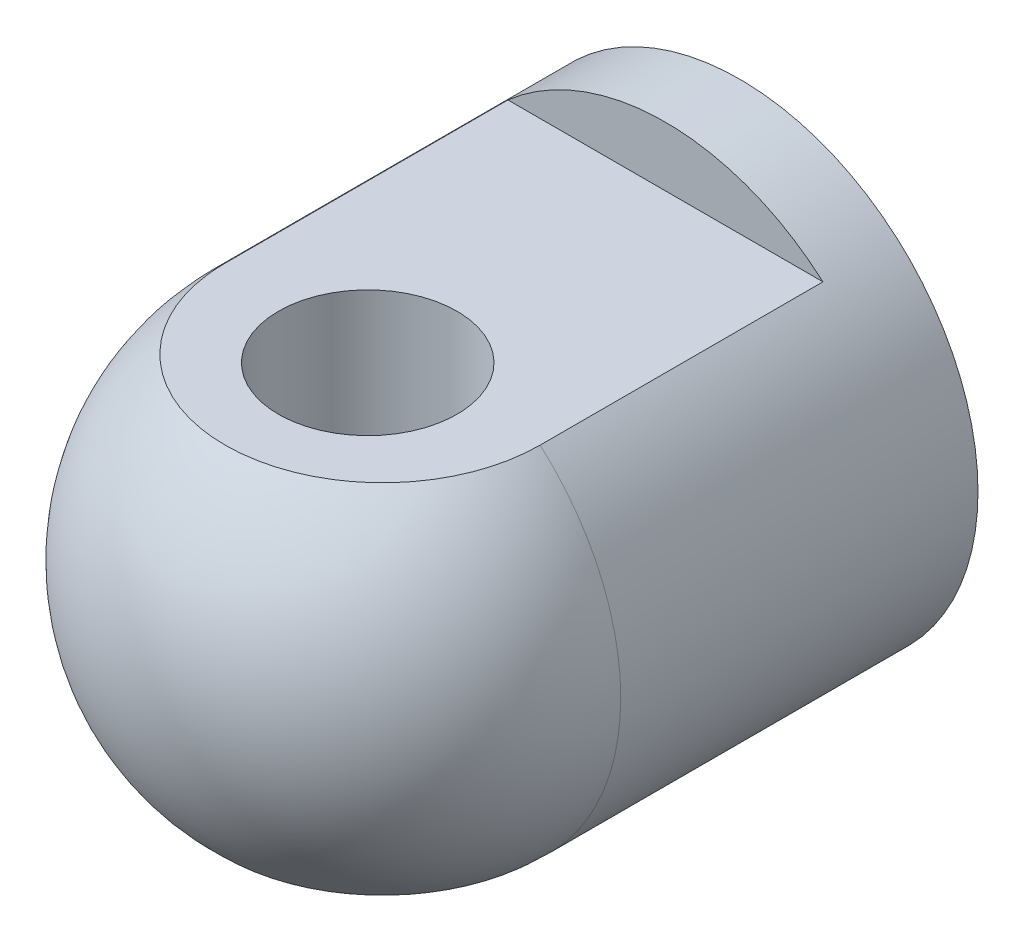
ISO-10303-21;
HEADER;
FILE_DESCRIPTION(('STEP AP214'),'2;1');
FILE_NAME('part.step','',(''),(''),'','','');
FILE_SCHEMA(('AUTOMOTIVE_DESIGN { 1 0 10303 214 1 1 1 1 }'));
ENDSEC;
DATA;
#1=APPLICATION_CONTEXT('core data for automotive mechanical design processes');
#2=APPLICATION_PROTOCOL_DEFINITION('international standard','automotive_design',2000,#1);
#3=PRODUCT_CONTEXT('',#1,'mechanical');
#4=PRODUCT('Part','Part','',(#3));
#5=PRODUCT_RELATED_PRODUCT_CATEGORY('part','',(#4));
#6=PRODUCT_DEFINITION_FORMATION('','',#4);
#7=PRODUCT_DEFINITION_CONTEXT('part definition',#1,'design');
#8=PRODUCT_DEFINITION('design','',#6,#7);
#9=PRODUCT_DEFINITION_SHAPE('','',#8);
#10=(LENGTH_UNIT() NAMED_UNIT(*) SI_UNIT(.MILLI.,.METRE.));
#11=(NAMED_UNIT(*) PLANE_ANGLE_UNIT() SI_UNIT($,.RADIAN.));
#12=(NAMED_UNIT(*) SI_UNIT($,.STERADIAN.) SOLID_ANGLE_UNIT());
#13=UNCERTAINTY_MEASURE_WITH_UNIT(LENGTH_MEASURE(1.E-05),#10,'distance_accuracy_value','');
#14=(GEOMETRIC_REPRESENTATION_CONTEXT(3) GLOBAL_UNCERTAINTY_ASSIGNED_CONTEXT((#13)) GLOBAL_UNIT_ASSIGNED_CONTEXT((#10,
#11,#12)) REPRESENTATION_CONTEXT('',''));
#15=CARTESIAN_POINT('',(0.,0.,0.));
#16=DIRECTION('',(0.,0.,1.));
#17=DIRECTION('',(1.,0.,0.));
#18=AXIS2_PLACEMENT_3D('',#15,#16,#17);
#19=CARTESIAN_POINT('',(0.,4.002,6.25));
#20=DIRECTION('',(0.,1.,0.));
#21=DIRECTION('',(-1.,0.,0.));
#22=AXIS2_PLACEMENT_3D('',#19,#20,#21);
#23=CYLINDRICAL_SURFACE('',#22,1.5);
#24=CARTESIAN_POINT('',(0.,-3.,6.25));
#25=DIRECTION('',(0.,1.,0.));
#26=DIRECTION('',(-1.,0.,0.));
#27=AXIS2_PLACEMENT_3D('',#24,#25,#26);
#28=CIRCLE('',#27,1.5);
#29=CARTESIAN_POINT('',(-1.5,-3.,6.25));
#30=VERTEX_POINT('',#29);
#31=EDGE_CURVE('E71',#30,#30,#28,.F.);
#32=ORIENTED_EDGE('',*,*,#31,.T.);
#33=EDGE_LOOP('',(#32));
#34=FACE_BOUND('',#33,.T.);
#35=CARTESIAN_POINT('',(0.,3.,6.25));
#36=DIRECTION('',(0.,1.,0.));
#37=DIRECTION('',(-1.,0.,0.));
#38=AXIS2_PLACEMENT_3D('',#35,#36,#37);
#39=CIRCLE('',#38,1.5);
#40=CARTESIAN_POINT('',(-1.5,3.,6.25));
#41=VERTEX_POINT('',#40);
#42=EDGE_CURVE('E120',#41,#41,#39,.T.);
#43=ORIENTED_EDGE('',*,*,#42,.T.);
#44=EDGE_LOOP('',(#43));
#45=FACE_BOUND('',#44,.T.);
#46=ADVANCED_FACE('F17',(#34,#45),#23,.F.);
#47=CARTESIAN_POINT('',(0.,0.,1.25));
#48=DIRECTION('',(0.,0.,1.));
#49=DIRECTION('',(1.,0.,0.));
#50=AXIS2_PLACEMENT_3D('',#47,#48,#49);
#51=PLANE('',#50);
#52=DIRECTION('',(-1.,0.,0.));
#53=VECTOR('',#52,1.);
#54=CARTESIAN_POINT('',(0.,-3.,1.25));
#55=LINE('',#54,#53);
#56=CARTESIAN_POINT('',(2.64575131106459,-3.,1.25));
#57=VERTEX_POINT('',#56);
#58=CARTESIAN_POINT('',(-2.64575131106459,-3.,1.25));
#59=VERTEX_POINT('',#58);
#60=EDGE_CURVE('E102',#57,#59,#55,.T.);
#61=ORIENTED_EDGE('',*,*,#60,.T.);
#62=CARTESIAN_POINT('',(0.,0.,1.25));
#63=DIRECTION('',(0.,0.,1.));
#64=DIRECTION('',(1.,0.,0.));
#65=AXIS2_PLACEMENT_3D('',#62,#63,#64);
#66=CIRCLE('',#65,4.);
#67=EDGE_CURVE('E91',#57,#59,#66,.F.);
#68=ORIENTED_EDGE('',*,*,#67,.F.);
#69=EDGE_LOOP('',(#61,#68));
#70=FACE_BOUND('',#69,.T.);
#71=ADVANCED_FACE('F129',(#70),#51,.T.);
#72=CARTESIAN_POINT('',(0.,0.,1.25));
#73=DIRECTION('',(0.,0.,1.));
#74=DIRECTION('',(1.,0.,0.));
#75=AXIS2_PLACEMENT_3D('',#72,#73,#74);
#76=PLANE('',#75);
#77=DIRECTION('',(1.,0.,0.));
#78=VECTOR('',#77,1.);
#79=CARTESIAN_POINT('',(0.,3.,1.25));
#80=LINE('',#79,#78);
#81=CARTESIAN_POINT('',(-2.64575131106459,3.,1.25));
#82=VERTEX_POINT('',#81);
#83=CARTESIAN_POINT('',(2.64575131106459,3.,1.25));
#84=VERTEX_POINT('',#83);
#85=EDGE_CURVE('E66',#82,#84,#80,.T.);
#86=ORIENTED_EDGE('',*,*,#85,.T.);
#87=CARTESIAN_POINT('',(0.,0.,1.25));
#88=DIRECTION('',(0.,0.,1.));
#89=DIRECTION('',(1.,0.,0.));
#90=AXIS2_PLACEMENT_3D('',#87,#88,#89);
#91=CIRCLE('',#90,4.);
#92=EDGE_CURVE('E79',#82,#84,#91,.F.);
#93=ORIENTED_EDGE('',*,*,#92,.F.);
#94=EDGE_LOOP('',(#86,#93));
#95=FACE_BOUND('',#94,.T.);
#96=ADVANCED_FACE('F127',(#95),#76,.T.);
#97=CARTESIAN_POINT('',(0.,3.,1.25));
#98=DIRECTION('',(0.,-1.,0.));
#99=DIRECTION('',(1.,0.,0.));
#100=AXIS2_PLACEMENT_3D('',#97,#98,#99);
#101=PLANE('',#100);
#102=DIRECTION('',(0.,0.,1.));
#103=VECTOR('',#102,1.);
#104=CARTESIAN_POINT('',(2.64575131106459,3.,10.));
#105=LINE('',#104,#103);
#106=CARTESIAN_POINT('',(2.64575131106459,3.,6.));
#107=VERTEX_POINT('',#106);
#108=EDGE_CURVE('E118',#84,#107,#105,.T.);
#109=ORIENTED_EDGE('',*,*,#108,.F.);
#110=ORIENTED_EDGE('',*,*,#85,.F.);
#111=DIRECTION('',(0.,0.,1.));
#112=VECTOR('',#111,1.);
#113=CARTESIAN_POINT('',(-2.6457513110646,3.,10.));
#114=LINE('',#113,#112);
#115=CARTESIAN_POINT('',(-2.64575131106459,3.,6.));
#116=VERTEX_POINT('',#115);
#117=EDGE_CURVE('E74',#116,#82,#114,.F.);
#118=ORIENTED_EDGE('',*,*,#117,.F.);
#119=CARTESIAN_POINT('',(2.64575131106459,3.,6.));
#120=CARTESIAN_POINT('',(2.64575843978466,3.,6.07441407751795));
#121=CARTESIAN_POINT('',(2.64261189448238,3.,6.14882477358548));
#122=CARTESIAN_POINT('',(2.63006662654231,3.,6.29711380384365));
#123=CARTESIAN_POINT('',(2.62066820326986,3.,6.37099216335352));
#124=CARTESIAN_POINT('',(2.59568312459834,3.,6.51764658621766));
#125=CARTESIAN_POINT('',(2.58010082367353,3.,6.59042338789464));
#126=CARTESIAN_POINT('',(2.54287440569758,3.,6.73438784358639));
#127=CARTESIAN_POINT('',(2.52123036230827,3.,6.80557551690078));
#128=CARTESIAN_POINT('',(2.44738123096619,3.,7.01606565706406));
#129=CARTESIAN_POINT('',(2.38624850541335,3.,7.15235734482172));
#130=CARTESIAN_POINT('',(2.24201134449796,3.,7.41263987733455));
#131=CARTESIAN_POINT('',(2.15891122566821,3.,7.53663313212285));
#132=CARTESIAN_POINT('',(1.97306553984951,3.,7.76893308391514));
#133=CARTESIAN_POINT('',(1.87031953976351,3.,7.87723943500596));
#134=CARTESIAN_POINT('',(1.64808904988257,3.,8.07507646815106));
#135=CARTESIAN_POINT('',(1.52860201334629,2.99999999999999,8.16460428832472));
#136=CARTESIAN_POINT('',(1.27629768528085,3.00000000000001,8.3223253613152));
#137=CARTESIAN_POINT('',(1.14348098244856,3.00000000000005,8.39051955577188));
#138=CARTESIAN_POINT('',(0.868292281389467,2.99999999999995,8.50363699413499));
#139=CARTESIAN_POINT('',(0.725920895061737,2.99999999999982,8.54856172665614));
#140=CARTESIAN_POINT('',(0.435655039868055,2.99999999999983,8.61387387560229));
#141=CARTESIAN_POINT('',(0.287760457883288,2.99999999999997,8.63426078919157));
#142=CARTESIAN_POINT('',(-0.00936052585580023,3.00000000000003,8.64991307978999));
#143=CARTESIAN_POINT('',(-0.158586958164495,2.99999999999993,8.64517787897872));
#144=CARTESIAN_POINT('',(-0.454107099100674,2.99999999999992,8.61073364918811));
#145=CARTESIAN_POINT('',(-0.600400836787989,3.,8.58102486779529));
#146=CARTESIAN_POINT('',(-0.885991565928041,3.,8.4974234804067));
#147=CARTESIAN_POINT('',(-1.02528857957599,2.99999999999992,8.44353095113269));
#148=CARTESIAN_POINT('',(-1.22584456454946,2.99999999999995,8.34581865713384));
#149=CARTESIAN_POINT('',(-1.29132987669097,2.99999999999999,8.3104130454267));
#150=CARTESIAN_POINT('',(-1.41908872226189,3.00000000000001,8.23421356435949));
#151=CARTESIAN_POINT('',(-1.48136299576491,3.,8.19342094437426));
#152=CARTESIAN_POINT('',(-1.60222646607823,3.,8.10675068375649));
#153=CARTESIAN_POINT('',(-1.6608171846753,3.00000000000002,8.06087516494865));
#154=CARTESIAN_POINT('',(-1.77397328145146,2.99999999999998,7.96432228000956));
#155=CARTESIAN_POINT('',(-1.82853472038279,2.99999999999994,7.91364032255056));
#156=CARTESIAN_POINT('',(-1.9854405687046,2.99999999999988,7.75502004299516));
#157=CARTESIAN_POINT('',(-2.08116893063373,2.99999999999997,7.64039060265645));
#158=CARTESIAN_POINT('',(-2.2519873492499,3.00000000000003,7.39667321856336));
#159=CARTESIAN_POINT('',(-2.32707819086606,3.,7.26758582496684));
#160=CARTESIAN_POINT('',(-2.42267343416461,3.,7.06593641106348));
#161=CARTESIAN_POINT('',(-2.45171964145834,3.,6.99730804043532));
#162=CARTESIAN_POINT('',(-2.50390896027006,3.,6.85788606734472));
#163=CARTESIAN_POINT('',(-2.52705685286434,3.,6.78709427098837));
#164=CARTESIAN_POINT('',(-2.56728200340044,3.,6.64388847405356));
#165=CARTESIAN_POINT('',(-2.58436520265804,3.,6.57147613541079));
#166=CARTESIAN_POINT('',(-2.61237144956919,3.,6.42548332676243));
#167=CARTESIAN_POINT('',(-2.62329630165545,3.,6.35190320542773));
#168=CARTESIAN_POINT('',(-2.63598704501018,3.,6.23180251935121));
#169=CARTESIAN_POINT('',(-2.63965097465986,3.,6.18547414532446));
#170=CARTESIAN_POINT('',(-2.64453133830871,3.,6.09276547830092));
#171=CARTESIAN_POINT('',(-2.64575180838452,3.,6.04638539774605));
#172=CARTESIAN_POINT('',(-2.64575131106459,3.,6.));
#173=B_SPLINE_CURVE_WITH_KNOTS('',3,(#119,#120,#121,#122,#123,#124,#125,#126,#127,#128,#129,
#130,#131,#132,#133,#134,#135,#136,#137,#138,#139,#140,#141,#142,#143,#144,#145,#146,#147,#148,
#149,#150,#151,#152,#153,#154,#155,#156,#157,#158,#159,#160,#161,#162,#163,#164,#165,#166,#167,
#168,#169,#170,#171,#172),.UNSPECIFIED.,.F.,.F.,(4,2,2,2,2,2,2,2,2,2,2,2,2,2,2,2,2,2,2,2,2,2,2,
2,2,2,4),(0.,0.223169632375207,0.446328579249822,0.669330663294486,0.892330037552097,
1.33814215220107,1.78386673101917,2.22960113705031,2.67540342449849,3.121186032008,
3.56694011799294,4.01270333833774,4.45847681149038,4.9042458653247,5.35001350498819,
5.57312734476023,5.79618952972694,6.019158947114,6.2423435425491,6.68812036782683,
7.13388023604574,7.3572249146653,7.58038797370584,7.80333180237389,8.02621027316172,
8.16557022146115,8.30469978615418),.UNSPECIFIED.);
#174=EDGE_CURVE('E59',#107,#116,#173,.T.);
#175=ORIENTED_EDGE('',*,*,#174,.F.);
#176=EDGE_LOOP('',(#109,#110,#118,#175));
#177=FACE_BOUND('',#176,.T.);
#178=ORIENTED_EDGE('',*,*,#42,.F.);
#179=EDGE_LOOP('',(#178));
#180=FACE_BOUND('',#179,.T.);
#181=ADVANCED_FACE('F75',(#177,#180),#101,.F.);
#182=CARTESIAN_POINT('',(0.,0.,6.));
#183=DIRECTION('',(1.,0.,0.));
#184=DIRECTION('',(0.,1.,0.));
#185=AXIS2_PLACEMENT_3D('',#182,#183,#184);
#186=SPHERICAL_SURFACE('',#185,4.);
#187=CARTESIAN_POINT('',(0.,0.,6.));
#188=DIRECTION('',(0.,0.,1.));
#189=DIRECTION('',(1.,0.,0.));
#190=AXIS2_PLACEMENT_3D('',#187,#188,#189);
#191=CIRCLE('',#190,4.);
#192=CARTESIAN_POINT('',(-4.,0.,6.));
#193=VERTEX_POINT('',#192);
#194=EDGE_CURVE('E35',#193,#116,#191,.F.);
#195=ORIENTED_EDGE('',*,*,#194,.F.);
#196=CARTESIAN_POINT('',(0.,0.,6.));
#197=DIRECTION('',(0.,0.,1.));
#198=DIRECTION('',(1.,0.,0.));
#199=AXIS2_PLACEMENT_3D('',#196,#197,#198);
#200=CIRCLE('',#199,4.);
#201=CARTESIAN_POINT('',(-2.64575131106459,-3.,6.));
#202=VERTEX_POINT('',#201);
#203=EDGE_CURVE('E84',#202,#193,#200,.F.);
#204=ORIENTED_EDGE('',*,*,#203,.F.);
#205=CARTESIAN_POINT('',(-2.64575131106459,-3.,6.));
#206=CARTESIAN_POINT('',(-2.64575843978466,-3.,6.07441407751795));
#207=CARTESIAN_POINT('',(-2.64261189448238,-3.,6.14882477358548));
#208=CARTESIAN_POINT('',(-2.63006662654231,-3.,6.29711380384365));
#209=CARTESIAN_POINT('',(-2.62066820326986,-3.,6.37099216335352));
#210=CARTESIAN_POINT('',(-2.59568312459834,-3.,6.51764658621766));
#211=CARTESIAN_POINT('',(-2.58010082367353,-3.,6.59042338789464));
#212=CARTESIAN_POINT('',(-2.54287440569758,-3.,6.73438784358639));
#213=CARTESIAN_POINT('',(-2.52123036230827,-3.,6.80557551690078));
#214=CARTESIAN_POINT('',(-2.44738123096619,-3.,7.01606565706406));
#215=CARTESIAN_POINT('',(-2.38624850541335,-3.,7.15235734482172));
#216=CARTESIAN_POINT('',(-2.24201134449796,-3.,7.41263987733455));
#217=CARTESIAN_POINT('',(-2.15891122566821,-3.,7.53663313212285));
#218=CARTESIAN_POINT('',(-1.9730655398495,-3.,7.76893308391514));
#219=CARTESIAN_POINT('',(-1.87031953976351,-3.,7.87723943500596));
#220=CARTESIAN_POINT('',(-1.64808904988257,-3.,8.07507646815106));
#221=CARTESIAN_POINT('',(-1.52860201334629,-2.99999999999999,8.16460428832472));
#222=CARTESIAN_POINT('',(-1.27629768528085,-3.00000000000002,8.3223253613152));
#223=CARTESIAN_POINT('',(-1.14348098244855,-3.00000000000005,8.39051955577188));
#224=CARTESIAN_POINT('',(-0.868292281389466,-2.99999999999995,8.50363699413499));
#225=CARTESIAN_POINT('',(-0.725920895061736,-2.99999999999981,8.54856172665614));
#226=CARTESIAN_POINT('',(-0.435655039868054,-2.99999999999983,8.61387387560229));
#227=CARTESIAN_POINT('',(-0.287760457883287,-2.99999999999997,8.63426078919157));
#228=CARTESIAN_POINT('',(0.00936052585580181,-3.00000000000003,8.64991307978999));
#229=CARTESIAN_POINT('',(0.158586958164496,-2.99999999999993,8.64517787897872));
#230=CARTESIAN_POINT('',(0.454107099100675,-2.99999999999992,8.61073364918811));
#231=CARTESIAN_POINT('',(0.600400836787989,-3.,8.58102486779529));
#232=CARTESIAN_POINT('',(0.885991565928042,-3.,8.49742348040669));
#233=CARTESIAN_POINT('',(1.02528857957599,-2.99999999999992,8.44353095113269));
#234=CARTESIAN_POINT('',(1.22584456454946,-2.99999999999995,8.34581865713384));
#235=CARTESIAN_POINT('',(1.29132987669097,-2.99999999999999,8.3104130454267));
#236=CARTESIAN_POINT('',(1.41908872226189,-3.00000000000001,8.23421356435949));
#237=CARTESIAN_POINT('',(1.48136299576491,-3.,8.19342094437426));
#238=CARTESIAN_POINT('',(1.60222646607824,-3.,8.10675068375649));
#239=CARTESIAN_POINT('',(1.6608171846753,-3.00000000000002,8.06087516494865));
#240=CARTESIAN_POINT('',(1.77397328145146,-2.99999999999998,7.96432228000955));
#241=CARTESIAN_POINT('',(1.82853472038279,-2.99999999999994,7.91364032255056));
#242=CARTESIAN_POINT('',(1.9854405687046,-2.99999999999988,7.75502004299516));
#243=CARTESIAN_POINT('',(2.08116893063373,-2.99999999999997,7.64039060265645));
#244=CARTESIAN_POINT('',(2.25198734924991,-3.00000000000003,7.39667321856335));
#245=CARTESIAN_POINT('',(2.32707819086606,-3.,7.26758582496684));
#246=CARTESIAN_POINT('',(2.42267343416461,-3.,7.06593641106348));
#247=CARTESIAN_POINT('',(2.45171964145834,-3.,6.99730804043532));
#248=CARTESIAN_POINT('',(2.50390896027006,-3.,6.85788606734471));
#249=CARTESIAN_POINT('',(2.52705685286434,-3.,6.78709427098836));
#250=CARTESIAN_POINT('',(2.56728200340044,-3.,6.64388847405356));
#251=CARTESIAN_POINT('',(2.58436520265803,-3.,6.57147613541079));
#252=CARTESIAN_POINT('',(2.61237144956919,-3.,6.42548332676242));
#253=CARTESIAN_POINT('',(2.62329630165545,-3.,6.35190320542773));
#254=CARTESIAN_POINT('',(2.63598704501018,-3.,6.23180251935121));
#255=CARTESIAN_POINT('',(2.63965097465986,-3.,6.18547414532446));
#256=CARTESIAN_POINT('',(2.64453133830871,-3.,6.09276547830092));
#257=CARTESIAN_POINT('',(2.64575180838452,-3.,6.04638539774605));
#258=CARTESIAN_POINT('',(2.64575131106459,-3.,6.));
#259=B_SPLINE_CURVE_WITH_KNOTS('',3,(#205,#206,#207,#208,#209,#210,#211,#212,#213,#214,#215,
#216,#217,#218,#219,#220,#221,#222,#223,#224,#225,#226,#227,#228,#229,#230,#231,#232,#233,#234,
#235,#236,#237,#238,#239,#240,#241,#242,#243,#244,#245,#246,#247,#248,#249,#250,#251,#252,#253,
#254,#255,#256,#257,#258),.UNSPECIFIED.,.F.,.F.,(4,2,2,2,2,2,2,2,2,2,2,2,2,2,2,2,2,2,2,2,2,2,2,
2,2,2,4),(0.,0.223169632375207,0.446328579249822,0.669330663294486,0.892330037552097,
1.33814215220107,1.78386673101917,2.22960113705031,2.67540342449849,3.121186032008,
3.56694011799294,4.01270333833774,4.45847681149038,4.9042458653247,5.35001350498819,
5.57312734476024,5.79618952972695,6.01915894711401,6.24234354254911,6.68812036782683,
7.13388023604575,7.3572249146653,7.58038797370584,7.80333180237389,8.02621027316172,
8.16557022146115,8.30469978615418),.UNSPECIFIED.);
#260=CARTESIAN_POINT('',(2.64575131106459,-3.,6.));
#261=VERTEX_POINT('',#260);
#262=EDGE_CURVE('E94',#202,#261,#259,.T.);
#263=ORIENTED_EDGE('',*,*,#262,.T.);
#264=CARTESIAN_POINT('',(0.,0.,6.));
#265=DIRECTION('',(0.,0.,1.));
#266=DIRECTION('',(1.,0.,0.));
#267=AXIS2_PLACEMENT_3D('',#264,#265,#266);
#268=CIRCLE('',#267,4.);
#269=CARTESIAN_POINT('',(4.,0.,6.));
#270=VERTEX_POINT('',#269);
#271=EDGE_CURVE('E124',#270,#261,#268,.F.);
#272=ORIENTED_EDGE('',*,*,#271,.F.);
#273=CARTESIAN_POINT('',(0.,0.,6.));
#274=DIRECTION('',(0.,0.,1.));
#275=DIRECTION('',(1.,0.,0.));
#276=AXIS2_PLACEMENT_3D('',#273,#274,#275);
#277=CIRCLE('',#276,4.);
#278=EDGE_CURVE('E69',#107,#270,#277,.F.);
#279=ORIENTED_EDGE('',*,*,#278,.F.);
#280=ORIENTED_EDGE('',*,*,#174,.T.);
#281=EDGE_LOOP('',(#195,#204,#263,#272,#279,#280));
#282=FACE_BOUND('',#281,.T.);
#283=ADVANCED_FACE('F67',(#282),#186,.T.);
#284=CARTESIAN_POINT('',(0.,-3.,1.25));
#285=DIRECTION('',(0.,1.,0.));
#286=DIRECTION('',(-1.,0.,0.));
#287=AXIS2_PLACEMENT_3D('',#284,#285,#286);
#288=PLANE('',#287);
#289=DIRECTION('',(0.,0.,1.));
#290=VECTOR('',#289,1.);
#291=CARTESIAN_POINT('',(-2.64575131106459,-3.,10.));
#292=LINE('',#291,#290);
#293=EDGE_CURVE('E86',#59,#202,#292,.T.);
#294=ORIENTED_EDGE('',*,*,#293,.F.);
#295=ORIENTED_EDGE('',*,*,#60,.F.);
#296=DIRECTION('',(0.,0.,1.));
#297=VECTOR('',#296,1.);
#298=CARTESIAN_POINT('',(2.64575131106459,-3.,10.));
#299=LINE('',#298,#297);
#300=EDGE_CURVE('E26',#261,#57,#299,.F.);
#301=ORIENTED_EDGE('',*,*,#300,.F.);
#302=ORIENTED_EDGE('',*,*,#262,.F.);
#303=EDGE_LOOP('',(#294,#295,#301,#302));
#304=FACE_BOUND('',#303,.T.);
#305=ORIENTED_EDGE('',*,*,#31,.F.);
#306=EDGE_LOOP('',(#305));
#307=FACE_BOUND('',#306,.T.);
#308=ADVANCED_FACE('F104',(#304,#307),#288,.F.);
#309=CARTESIAN_POINT('',(0.,0.,0.));
#310=DIRECTION('',(0.,0.,1.));
#311=DIRECTION('',(1.,0.,0.));
#312=AXIS2_PLACEMENT_3D('',#309,#310,#311);
#313=PLANE('',#312);
#314=CARTESIAN_POINT('',(0.,0.,0.));
#315=DIRECTION('',(0.,0.,1.));
#316=DIRECTION('',(1.,0.,0.));
#317=AXIS2_PLACEMENT_3D('',#314,#315,#316);
#318=CIRCLE('',#317,4.);
#319=CARTESIAN_POINT('',(4.,0.,0.));
#320=VERTEX_POINT('',#319);
#321=EDGE_CURVE('E11',#320,#320,#318,.T.);
#322=ORIENTED_EDGE('',*,*,#321,.F.);
#323=EDGE_LOOP('',(#322));
#324=FACE_BOUND('',#323,.T.);
#325=ADVANCED_FACE('F137',(#324),#313,.F.);
#326=CARTESIAN_POINT('',(0.,0.,10.));
#327=DIRECTION('',(0.,0.,1.));
#328=DIRECTION('',(1.,0.,0.));
#329=AXIS2_PLACEMENT_3D('',#326,#327,#328);
#330=CYLINDRICAL_SURFACE('',#329,4.);
#331=ORIENTED_EDGE('',*,*,#321,.T.);
#332=EDGE_LOOP('',(#331));
#333=FACE_BOUND('',#332,.T.);
#334=ORIENTED_EDGE('',*,*,#271,.T.);
#335=ORIENTED_EDGE('',*,*,#300,.T.);
#336=ORIENTED_EDGE('',*,*,#67,.T.);
#337=ORIENTED_EDGE('',*,*,#293,.T.);
#338=ORIENTED_EDGE('',*,*,#203,.T.);
#339=ORIENTED_EDGE('',*,*,#194,.T.);
#340=ORIENTED_EDGE('',*,*,#117,.T.);
#341=ORIENTED_EDGE('',*,*,#92,.T.);
#342=ORIENTED_EDGE('',*,*,#108,.T.);
#343=ORIENTED_EDGE('',*,*,#278,.T.);
#344=EDGE_LOOP('',(#334,#335,#336,#337,#338,#339,#340,#341,#342,#343));
#345=FACE_BOUND('',#344,.T.);
#346=ADVANCED_FACE('F82',(#333,#345),#330,.T.);
#347=CLOSED_SHELL('',(#46,#71,#96,#181,#283,#308,#325,#346));
#348=MANIFOLD_SOLID_BREP('B1',#347);
#349=ADVANCED_BREP_SHAPE_REPRESENTATION('',(#18,#348),#14);
#350=SHAPE_DEFINITION_REPRESENTATION(#9,#349);
ENDSEC;
END-ISO-10303-21;
